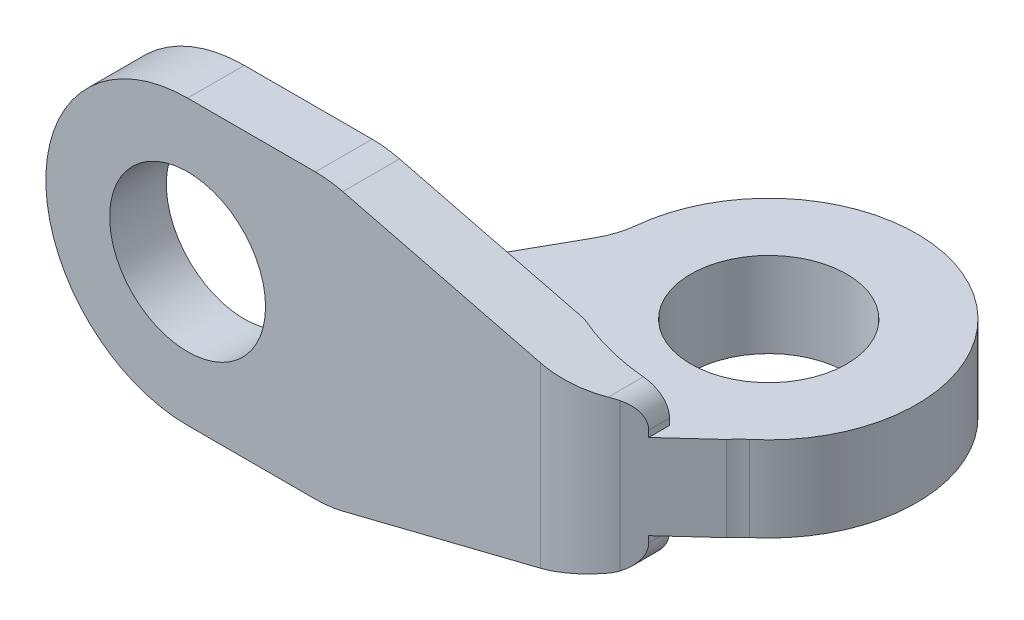
ISO-10303-21;
HEADER;
FILE_DESCRIPTION(('STEP AP214'),'2;1');
FILE_NAME('part.step','',(''),(''),'','','');
FILE_SCHEMA(('AUTOMOTIVE_DESIGN { 1 0 10303 214 1 1 1 1 }'));
ENDSEC;
DATA;
#1=APPLICATION_CONTEXT('core data for automotive mechanical design processes');
#2=APPLICATION_PROTOCOL_DEFINITION('international standard','automotive_design',2000,#1);
#3=PRODUCT_CONTEXT('',#1,'mechanical');
#4=PRODUCT('Part','Part','',(#3));
#5=PRODUCT_RELATED_PRODUCT_CATEGORY('part','',(#4));
#6=PRODUCT_DEFINITION_FORMATION('','',#4);
#7=PRODUCT_DEFINITION_CONTEXT('part definition',#1,'design');
#8=PRODUCT_DEFINITION('design','',#6,#7);
#9=PRODUCT_DEFINITION_SHAPE('','',#8);
#10=(LENGTH_UNIT() NAMED_UNIT(*) SI_UNIT(.MILLI.,.METRE.));
#11=(NAMED_UNIT(*) PLANE_ANGLE_UNIT() SI_UNIT($,.RADIAN.));
#12=(NAMED_UNIT(*) SI_UNIT($,.STERADIAN.) SOLID_ANGLE_UNIT());
#13=UNCERTAINTY_MEASURE_WITH_UNIT(LENGTH_MEASURE(1.E-05),#10,'distance_accuracy_value','');
#14=(GEOMETRIC_REPRESENTATION_CONTEXT(3) GLOBAL_UNCERTAINTY_ASSIGNED_CONTEXT((#13)) GLOBAL_UNIT_ASSIGNED_CONTEXT((#10,
#11,#12)) REPRESENTATION_CONTEXT('',''));
#15=CARTESIAN_POINT('',(0.,0.,0.));
#16=DIRECTION('',(0.,0.,1.));
#17=DIRECTION('',(1.,0.,0.));
#18=AXIS2_PLACEMENT_3D('',#15,#16,#17);
#19=CARTESIAN_POINT('',(0.,0.,0.));
#20=DIRECTION('',(0.,0.,1.));
#21=DIRECTION('',(1.,0.,0.));
#22=AXIS2_PLACEMENT_3D('',#19,#20,#21);
#23=PLANE('',#22);
#24=CARTESIAN_POINT('',(5.,-5.,0.));
#25=DIRECTION('',(0.,0.,1.));
#26=DIRECTION('',(1.,0.,0.));
#27=AXIS2_PLACEMENT_3D('',#24,#25,#26);
#28=CIRCLE('',#27,2.75);
#29=CARTESIAN_POINT('',(7.75,-5.,0.));
#30=VERTEX_POINT('',#29);
#31=EDGE_CURVE('E387',#30,#30,#28,.T.);
#32=ORIENTED_EDGE('',*,*,#31,.T.);
#33=EDGE_LOOP('',(#32));
#34=FACE_BOUND('',#33,.T.);
#35=DIRECTION('',(0.,-1.,0.));
#36=VECTOR('',#35,1.);
#37=CARTESIAN_POINT('',(16.9965399890817,-1.19168295648882E-13,0.));
#38=LINE('',#37,#36);
#39=CARTESIAN_POINT('',(16.9965399890816,-3.50000000000012,0.));
#40=VERTEX_POINT('',#39);
#41=CARTESIAN_POINT('',(16.9965399890817,-1.74913499727042,0.));
#42=VERTEX_POINT('',#41);
#43=EDGE_CURVE('E53',#40,#42,#38,.F.);
#44=ORIENTED_EDGE('',*,*,#43,.F.);
#45=DIRECTION('',(1.,0.,0.));
#46=VECTOR('',#45,1.);
#47=CARTESIAN_POINT('',(0.,-3.5,0.));
#48=LINE('',#47,#46);
#49=CARTESIAN_POINT('',(8.71917257421547,-3.50000000000006,0.));
#50=VERTEX_POINT('',#49);
#51=EDGE_CURVE('E197',#50,#40,#48,.T.);
#52=ORIENTED_EDGE('',*,*,#51,.F.);
#53=DIRECTION('',(0.,-1.,0.));
#54=VECTOR('',#53,1.);
#55=CARTESIAN_POINT('',(8.71917257421545,-6.50000000000006,0.));
#56=LINE('',#55,#54);
#57=CARTESIAN_POINT('',(8.71917257421545,-6.50000000000006,0.));
#58=VERTEX_POINT('',#57);
#59=EDGE_CURVE('E220',#50,#58,#56,.T.);
#60=ORIENTED_EDGE('',*,*,#59,.T.);
#61=DIRECTION('',(1.,0.,0.));
#62=VECTOR('',#61,1.);
#63=CARTESIAN_POINT('',(0.,-6.5,0.));
#64=LINE('',#63,#62);
#65=CARTESIAN_POINT('',(17.,-6.50000000000012,0.));
#66=VERTEX_POINT('',#65);
#67=EDGE_CURVE('E209',#58,#66,#64,.T.);
#68=ORIENTED_EDGE('',*,*,#67,.T.);
#69=DIRECTION('',(0.,1.,0.));
#70=VECTOR('',#69,1.);
#71=CARTESIAN_POINT('',(17.,-10.0000000000001,0.));
#72=LINE('',#71,#70);
#73=CARTESIAN_POINT('',(17.,-8.25,0.));
#74=VERTEX_POINT('',#73);
#75=EDGE_CURVE('E11',#74,#66,#72,.T.);
#76=ORIENTED_EDGE('',*,*,#75,.F.);
#77=DIRECTION('',(-0.970142500145332,-0.242535625036333,0.));
#78=VECTOR('',#77,1.);
#79=CARTESIAN_POINT('',(2.94117647058824,-11.7647058823529,0.));
#80=LINE('',#79,#78);
#81=CARTESIAN_POINT('',(10.4765256976805,-9.88086857557987,0.));
#82=VERTEX_POINT('',#81);
#83=EDGE_CURVE('E369',#74,#82,#80,.T.);
#84=ORIENTED_EDGE('',*,*,#83,.T.);
#85=CARTESIAN_POINT('',(9.50880855378553,-6.01,0.));
#86=DIRECTION('',(0.,0.,1.));
#87=DIRECTION('',(1.,0.,0.));
#88=AXIS2_PLACEMENT_3D('',#85,#86,#87);
#89=CIRCLE('',#88,3.99);
#90=CARTESIAN_POINT('',(9.50880855378552,-10.,0.));
#91=VERTEX_POINT('',#90);
#92=EDGE_CURVE('E371',#82,#91,#89,.F.);
#93=ORIENTED_EDGE('',*,*,#92,.T.);
#94=DIRECTION('',(1.,0.,0.));
#95=VECTOR('',#94,1.);
#96=CARTESIAN_POINT('',(0.,-10.,0.));
#97=LINE('',#96,#95);
#98=CARTESIAN_POINT('',(5.,-10.,0.));
#99=VERTEX_POINT('',#98);
#100=EDGE_CURVE('E374',#99,#91,#97,.T.);
#101=ORIENTED_EDGE('',*,*,#100,.F.);
#102=CARTESIAN_POINT('',(5.,-5.,0.));
#103=DIRECTION('',(0.,0.,1.));
#104=DIRECTION('',(1.,0.,0.));
#105=AXIS2_PLACEMENT_3D('',#102,#103,#104);
#106=CIRCLE('',#105,5.);
#107=CARTESIAN_POINT('',(5.,0.,0.));
#108=VERTEX_POINT('',#107);
#109=EDGE_CURVE('E377',#108,#99,#106,.T.);
#110=ORIENTED_EDGE('',*,*,#109,.F.);
#111=DIRECTION('',(1.,0.,0.));
#112=VECTOR('',#111,1.);
#113=CARTESIAN_POINT('',(0.,0.,0.));
#114=LINE('',#113,#112);
#115=CARTESIAN_POINT('',(9.50880855378552,0.,0.));
#116=VERTEX_POINT('',#115);
#117=EDGE_CURVE('E380',#108,#116,#114,.T.);
#118=ORIENTED_EDGE('',*,*,#117,.T.);
#119=CARTESIAN_POINT('',(9.50880855378553,-3.99,0.));
#120=DIRECTION('',(0.,0.,1.));
#121=DIRECTION('',(1.,0.,0.));
#122=AXIS2_PLACEMENT_3D('',#119,#120,#121);
#123=CIRCLE('',#122,3.99);
#124=CARTESIAN_POINT('',(10.4765256976805,-0.119131424420129,0.));
#125=VERTEX_POINT('',#124);
#126=EDGE_CURVE('E383',#125,#116,#123,.T.);
#127=ORIENTED_EDGE('',*,*,#126,.F.);
#128=DIRECTION('',(-0.970142500145332,0.242535625036333,0.));
#129=VECTOR('',#128,1.);
#130=CARTESIAN_POINT('',(0.588235294117647,2.35294117647059,0.));
#131=LINE('',#130,#129);
#132=EDGE_CURVE('E200',#42,#125,#131,.T.);
#133=ORIENTED_EDGE('',*,*,#132,.F.);
#134=EDGE_LOOP('',(#44,#52,#60,#68,#76,#84,#93,#101,#110,#118,#127,#133));
#135=FACE_BOUND('',#134,.T.);
#136=ADVANCED_FACE('F37',(#34,#135),#23,.F.);
#137=CARTESIAN_POINT('',(20.,0.,2.));
#138=DIRECTION('',(1.,0.,0.));
#139=DIRECTION('',(0.,0.,-1.));
#140=AXIS2_PLACEMENT_3D('',#137,#138,#139);
#141=PLANE('',#140);
#142=DIRECTION('',(0.,0.,-1.));
#143=VECTOR('',#142,1.);
#144=CARTESIAN_POINT('',(20.,-3.50000000000014,2.));
#145=LINE('',#144,#143);
#146=CARTESIAN_POINT('',(20.,-3.50000000000014,0.733070249327034));
#147=VERTEX_POINT('',#146);
#148=CARTESIAN_POINT('',(20.,-3.50000000000014,0.00103909247175984));
#149=VERTEX_POINT('',#148);
#150=EDGE_CURVE('E389',#147,#149,#145,.T.);
#151=ORIENTED_EDGE('',*,*,#150,.T.);
#152=DIRECTION('',(0.,-1.,0.));
#153=VECTOR('',#152,1.);
#154=CARTESIAN_POINT('',(20.,-1.29670579829266E-13,0.00103909247176591));
#155=LINE('',#154,#153);
#156=CARTESIAN_POINT('',(20.,-3.28077640640442,0.00103909247175897));
#157=VERTEX_POINT('',#156);
#158=EDGE_CURVE('E187',#149,#157,#155,.F.);
#159=ORIENTED_EDGE('',*,*,#158,.T.);
#160=DIRECTION('',(0.,0.,-1.));
#161=VECTOR('',#160,1.);
#162=CARTESIAN_POINT('',(20.,-3.28077640640442,2.));
#163=LINE('',#162,#161);
#164=CARTESIAN_POINT('',(20.,-3.28077640640442,0.733070249327036));
#165=VERTEX_POINT('',#164);
#166=EDGE_CURVE('E335',#165,#157,#163,.T.);
#167=ORIENTED_EDGE('',*,*,#166,.F.);
#168=DIRECTION('',(0.,-1.,0.));
#169=VECTOR('',#168,1.);
#170=CARTESIAN_POINT('',(20.,0.,0.733070249327057));
#171=LINE('',#170,#169);
#172=EDGE_CURVE('E427',#165,#147,#171,.T.);
#173=ORIENTED_EDGE('',*,*,#172,.T.);
#174=EDGE_LOOP('',(#151,#159,#167,#173));
#175=FACE_BOUND('',#174,.T.);
#176=ADVANCED_FACE('F261',(#175),#141,.T.);
#177=CARTESIAN_POINT('',(19.,-3.28077640640441,2.));
#178=DIRECTION('',(0.,0.,-1.));
#179=DIRECTION('',(-1.,0.,0.));
#180=AXIS2_PLACEMENT_3D('',#177,#178,#179);
#181=CYLINDRICAL_SURFACE('',#180,1.);
#182=ORIENTED_EDGE('',*,*,#166,.T.);
#183=CARTESIAN_POINT('',(20.,-3.28077640640442,0.00103909247175897));
#184=CARTESIAN_POINT('',(20.0000004772201,-3.25334084201838,0.00103759160879816));
#185=CARTESIAN_POINT('',(19.9988702001035,-3.22591893937733,0.00137810557981637));
#186=CARTESIAN_POINT('',(19.99436544436,-3.17128161308369,0.00272647186715329));
#187=CARTESIAN_POINT('',(19.9909913785738,-3.1440661523788,0.00373420142052705));
#188=CARTESIAN_POINT('',(19.9775555582896,-3.06314392427122,0.00772543560410502));
#189=CARTESIAN_POINT('',(19.9641799405173,-3.00999580997832,0.0116771864258372));
#190=CARTESIAN_POINT('',(19.9290499600717,-2.90682408023911,0.021806194839278));
#191=CARTESIAN_POINT('',(19.9072973608673,-2.85679980975516,0.0279829840124034));
#192=CARTESIAN_POINT('',(19.8560915355715,-2.76111133392463,0.0420343855772149));
#193=CARTESIAN_POINT('',(19.8266364910755,-2.71544816163252,0.0499093988110608));
#194=CARTESIAN_POINT('',(19.7600582698721,-2.62856555197105,0.0669368824096268));
#195=CARTESIAN_POINT('',(19.7227668240214,-2.58748034229938,0.0761156481917256));
#196=CARTESIAN_POINT('',(19.6419711337831,-2.51205663333524,0.0949011354599723));
#197=CARTESIAN_POINT('',(19.5984651843595,-2.47771999177006,0.104507973894493));
#198=CARTESIAN_POINT('',(19.5052356013029,-2.4159461336284,0.123688893339063));
#199=CARTESIAN_POINT('',(19.4553883005009,-2.3886932524952,0.133256713958323));
#200=CARTESIAN_POINT('',(19.3516508545179,-2.3429175309554,0.151497907329219));
#201=CARTESIAN_POINT('',(19.2977582737753,-2.32439999955168,0.160170733643648));
#202=CARTESIAN_POINT('',(19.2425356250363,-2.31063390625908,0.168078255017298));
#203=B_SPLINE_CURVE_WITH_KNOTS('',3,(#183,#184,#185,#186,#187,#188,#189,#190,#191,#192,#193,
#194,#195,#196,#197,#198,#199,#200,#201,#202),.UNSPECIFIED.,.F.,.F.,(4,2,2,2,2,2,2,2,2,4),(0.,
0.0822544623321365,0.164493794629507,0.328482469060576,0.492436640493811,0.656429553468826,
0.824389791870318,0.992396201345743,1.16441453607366,1.33653728253201),.UNSPECIFIED.);
#204=CARTESIAN_POINT('',(19.2425356250363,-2.31063390625908,0.168078255017298));
#205=VERTEX_POINT('',#204);
#206=EDGE_CURVE('E269',#157,#205,#203,.T.);
#207=ORIENTED_EDGE('',*,*,#206,.T.);
#208=DIRECTION('',(0.,0.,-1.));
#209=VECTOR('',#208,1.);
#210=CARTESIAN_POINT('',(19.2425356250363,-2.31063390625908,2.));
#211=LINE('',#210,#209);
#212=CARTESIAN_POINT('',(19.2425356250363,-2.31063390625908,1.40496744680136));
#213=VERTEX_POINT('',#212);
#214=EDGE_CURVE('E214',#213,#205,#211,.T.);
#215=ORIENTED_EDGE('',*,*,#214,.F.);
#216=CARTESIAN_POINT('',(19.2425356250363,-2.31063390625908,1.40496744680136));
#217=CARTESIAN_POINT('',(19.2629985050456,-2.31575029922606,1.38970942599475));
#218=CARTESIAN_POINT('',(19.2831651836685,-2.32147912347447,1.37426407524347));
#219=CARTESIAN_POINT('',(19.3228244442266,-2.33408927877527,1.34309247866337));
#220=CARTESIAN_POINT('',(19.3423186198614,-2.34096762150088,1.32736705325976));
#221=CARTESIAN_POINT('',(19.3806555117763,-2.35583094343052,1.29565102053927));
#222=CARTESIAN_POINT('',(19.3994982539455,-2.36381587859356,1.27966042379818));
#223=CARTESIAN_POINT('',(19.4365587906207,-2.38086912959531,1.24742588586675));
#224=CARTESIAN_POINT('',(19.4547748569164,-2.38994017357489,1.2311813997572));
#225=CARTESIAN_POINT('',(19.4726419843778,-2.39952187188822,1.21485744333106));
#226=B_SPLINE_CURVE_WITH_KNOTS('',3,(#216,#217,#218,#219,#220,#221,#222,#223,#224,#225),
.UNSPECIFIED.,.F.,.F.,(4,2,2,2,4),(0.,0.0780854318201866,0.155970940822855,0.233853350968623,
0.31193566428967),.UNSPECIFIED.);
#227=CARTESIAN_POINT('',(19.4726419843777,-2.39952187188925,1.2148574433312));
#228=VERTEX_POINT('',#227);
#229=EDGE_CURVE('E246',#213,#228,#226,.T.);
#230=ORIENTED_EDGE('',*,*,#229,.T.);
#231=CARTESIAN_POINT('',(19.,-3.28077640640441,1.64665680671652));
#232=DIRECTION('',(0.674487995587138,0.,0.738285814443732));
#233=DIRECTION('',(0.738285814443732,0.,-0.674487995587138));
#234=AXIS2_PLACEMENT_3D('',#231,#232,#233);
#235=ELLIPSE('',#234,1.35448898033272,1.);
#236=EDGE_CURVE('E425',#228,#165,#235,.F.);
#237=ORIENTED_EDGE('',*,*,#236,.T.);
#238=EDGE_LOOP('',(#182,#207,#215,#230,#237));
#239=FACE_BOUND('',#238,.T.);
#240=ADVANCED_FACE('F255',(#239),#181,.T.);
#241=CARTESIAN_POINT('',(19.,-6.71922359359558,2.));
#242=DIRECTION('',(0.,0.,-1.));
#243=DIRECTION('',(-1.,0.,0.));
#244=AXIS2_PLACEMENT_3D('',#241,#242,#243);
#245=CYLINDRICAL_SURFACE('',#244,1.);
#246=CARTESIAN_POINT('',(20.,-6.71922359359558,0.));
#247=CARTESIAN_POINT('',(20.0000004774727,-6.7466588893682,-1.50124823427157E-06));
#248=CARTESIAN_POINT('',(19.9988702222173,-6.77408052331161,0.000339076923073397));
#249=CARTESIAN_POINT('',(19.9943655553478,-6.82871730998671,0.00168769678453366));
#250=CARTESIAN_POINT('',(19.9909915566896,-6.85593249978194,0.00269561565193194));
#251=CARTESIAN_POINT('',(19.9775560134425,-6.93685388125148,0.00668759640664147));
#252=CARTESIAN_POINT('',(19.9641806811535,-6.9900014187888,0.0106400832058489));
#253=CARTESIAN_POINT('',(19.9290514964954,-7.09317200446699,0.0207709625185773));
#254=CARTESIAN_POINT('',(19.9072994096127,-7.14319570840759,0.0269488859809006));
#255=CARTESIAN_POINT('',(19.8560948384683,-7.2388831471983,0.0410028535114292));
#256=CARTESIAN_POINT('',(19.8266405341629,-7.28454584805153,0.0488792988652389));
#257=CARTESIAN_POINT('',(19.76006371641,-7.37142807189875,0.0659099508878017));
#258=CARTESIAN_POINT('',(19.7227728736884,-7.41251331931119,0.0750904678011097));
#259=CARTESIAN_POINT('',(19.6419784435355,-7.48793723441399,0.0938795494802727));
#260=CARTESIAN_POINT('',(19.5984731510726,-7.52227404440171,0.103488231220403));
#261=CARTESIAN_POINT('',(19.5052431510538,-7.58404956376032,0.122673211617995));
#262=CARTESIAN_POINT('',(19.4553945797887,-7.61130364985571,0.132243239385581));
#263=CARTESIAN_POINT('',(19.3516542381598,-7.65708130513248,0.150488629127796));
#264=CARTESIAN_POINT('',(19.2977600308004,-7.67559956233918,0.159163444254734));
#265=CARTESIAN_POINT('',(19.2425356250363,-7.68936609374092,0.167072754040908));
#266=B_SPLINE_CURVE_WITH_KNOTS('',3,(#246,#247,#248,#249,#250,#251,#252,#253,#254,#255,#256,
#257,#258,#259,#260,#261,#262,#263,#264,#265),.UNSPECIFIED.,.F.,.F.,(4,2,2,2,2,2,2,2,2,4),(0.,
0.0822536562973416,0.164492178176201,0.328479134498837,0.492431547795576,0.65642273831652,
0.824382731891326,0.992388896751938,1.16441326430609,1.3365420999051),.UNSPECIFIED.);
#267=CARTESIAN_POINT('',(20.,-6.71922359359558,0.));
#268=VERTEX_POINT('',#267);
#269=CARTESIAN_POINT('',(19.2425356250363,-7.68936609374092,0.167072754040909));
#270=VERTEX_POINT('',#269);
#271=EDGE_CURVE('E289',#268,#270,#266,.T.);
#272=ORIENTED_EDGE('',*,*,#271,.F.);
#273=DIRECTION('',(0.,0.,-1.));
#274=VECTOR('',#273,1.);
#275=CARTESIAN_POINT('',(20.,-6.71922359359558,2.));
#276=LINE('',#275,#274);
#277=CARTESIAN_POINT('',(20.,-6.71922359359558,0.733070249327015));
#278=VERTEX_POINT('',#277);
#279=EDGE_CURVE('E362',#278,#268,#276,.T.);
#280=ORIENTED_EDGE('',*,*,#279,.F.);
#281=CARTESIAN_POINT('',(19.,-6.71922359359558,1.64665680671649));
#282=DIRECTION('',(0.674487995587138,0.,0.738285814443732));
#283=DIRECTION('',(0.738285814443732,0.,-0.674487995587138));
#284=AXIS2_PLACEMENT_3D('',#281,#282,#283);
#285=ELLIPSE('',#284,1.35448898033272,1.);
#286=CARTESIAN_POINT('',(19.4726419843776,-7.60047812811077,1.2148574433312));
#287=VERTEX_POINT('',#286);
#288=EDGE_CURVE('E432',#287,#278,#285,.T.);
#289=ORIENTED_EDGE('',*,*,#288,.F.);
#290=CARTESIAN_POINT('',(19.4726419843776,-7.60047812811077,1.2148574433312));
#291=CARTESIAN_POINT('',(19.4547748569164,-7.61005982642473,1.23118139975719));
#292=CARTESIAN_POINT('',(19.4365587906207,-7.61913087040457,1.2474258858667));
#293=CARTESIAN_POINT('',(19.3994982539455,-7.63618412140652,1.2796604237981));
#294=CARTESIAN_POINT('',(19.3806555117764,-7.64416905656949,1.29565102053922));
#295=CARTESIAN_POINT('',(19.3423186198614,-7.65903237849909,1.32736705325972));
#296=CARTESIAN_POINT('',(19.3228244442266,-7.66591072122471,1.34309247866334));
#297=CARTESIAN_POINT('',(19.2831651836685,-7.67852087652554,1.37426407524344));
#298=CARTESIAN_POINT('',(19.2629985050456,-7.68424970077397,1.38970942599472));
#299=CARTESIAN_POINT('',(19.2425356250363,-7.68936609374092,1.40496744680133));
#300=B_SPLINE_CURVE_WITH_KNOTS('',3,(#290,#291,#292,#293,#294,#295,#296,#297,#298,#299),
.UNSPECIFIED.,.F.,.F.,(4,2,2,2,4),(0.,0.0780823133211076,0.155964723466912,0.233850232469582,
0.311935664289792),.UNSPECIFIED.);
#301=CARTESIAN_POINT('',(19.2425356250363,-7.68936609374092,1.40496744680133));
#302=VERTEX_POINT('',#301);
#303=EDGE_CURVE('E310',#287,#302,#300,.T.);
#304=ORIENTED_EDGE('',*,*,#303,.T.);
#305=DIRECTION('',(0.,0.,-1.));
#306=VECTOR('',#305,1.);
#307=CARTESIAN_POINT('',(19.2425356250363,-7.68936609374092,2.));
#308=LINE('',#307,#306);
#309=EDGE_CURVE('E325',#302,#270,#308,.T.);
#310=ORIENTED_EDGE('',*,*,#309,.T.);
#311=EDGE_LOOP('',(#272,#280,#289,#304,#310));
#312=FACE_BOUND('',#311,.T.);
#313=ADVANCED_FACE('F260',(#312),#245,.T.);
#314=CARTESIAN_POINT('',(0.588235294117647,2.35294117647059,2.));
#315=DIRECTION('',(-0.242535625036333,-0.970142500145332,0.));
#316=DIRECTION('',(0.970142500145332,-0.242535625036333,0.));
#317=AXIS2_PLACEMENT_3D('',#314,#315,#316);
#318=PLANE('',#317);
#319=CARTESIAN_POINT('',(18.5,-2.12500000000001,-5.));
#320=DIRECTION('',(-0.242535625036333,-0.970142500145332,0.));
#321=DIRECTION('',(0.970142500145332,-0.242535625036333,0.));
#322=AXIS2_PLACEMENT_3D('',#319,#320,#321);
#323=ELLIPSE('',#322,5.38183672222667,5.22114853307495);
#324=EDGE_CURVE('E192',#42,#205,#323,.F.);
#325=ORIENTED_EDGE('',*,*,#324,.F.);
#326=ORIENTED_EDGE('',*,*,#132,.T.);
#327=DIRECTION('',(0.,0.,-1.));
#328=VECTOR('',#327,1.);
#329=CARTESIAN_POINT('',(10.4765256976805,-0.119131424420129,2.));
#330=LINE('',#329,#328);
#331=CARTESIAN_POINT('',(10.4765256976805,-0.119131424420129,2.));
#332=VERTEX_POINT('',#331);
#333=EDGE_CURVE('E346',#332,#125,#330,.T.);
#334=ORIENTED_EDGE('',*,*,#333,.F.);
#335=DIRECTION('',(-0.970142500145332,0.242535625036333,0.));
#336=VECTOR('',#335,1.);
#337=CARTESIAN_POINT('',(0.588235294117647,2.35294117647059,2.));
#338=LINE('',#337,#336);
#339=CARTESIAN_POINT('',(17.4491779976163,-1.86229449940407,2.));
#340=VERTEX_POINT('',#339);
#341=EDGE_CURVE('E343',#340,#332,#338,.T.);
#342=ORIENTED_EDGE('',*,*,#341,.F.);
#343=CARTESIAN_POINT('',(17.4491779976163,-1.86229449940407,-1.));
#344=DIRECTION('',(-0.242535625036333,-0.970142500145332,0.));
#345=DIRECTION('',(-0.970142500145332,0.242535625036333,0.));
#346=AXIS2_PLACEMENT_3D('',#343,#344,#345);
#347=ELLIPSE('',#346,3.09232921921324,3.);
#348=EDGE_CURVE('E244',#340,#213,#347,.F.);
#349=ORIENTED_EDGE('',*,*,#348,.T.);
#350=ORIENTED_EDGE('',*,*,#214,.T.);
#351=EDGE_LOOP('',(#325,#326,#334,#342,#349,#350));
#352=FACE_BOUND('',#351,.T.);
#353=ADVANCED_FACE('F263',(#352),#318,.F.);
#354=CARTESIAN_POINT('',(2.94117647058824,-11.7647058823529,2.));
#355=DIRECTION('',(0.242535625036333,-0.970142500145332,0.));
#356=DIRECTION('',(0.970142500145332,0.242535625036333,0.));
#357=AXIS2_PLACEMENT_3D('',#354,#355,#356);
#358=PLANE('',#357);
#359=ORIENTED_EDGE('',*,*,#83,.F.);
#360=CARTESIAN_POINT('',(18.5,-7.875,-5.));
#361=DIRECTION('',(0.242535625036333,-0.970142500145332,0.));
#362=DIRECTION('',(0.970142500145332,0.242535625036333,0.));
#363=AXIS2_PLACEMENT_3D('',#360,#361,#362);
#364=ELLIPSE('',#363,5.38081081250773,5.22015325445527);
#365=EDGE_CURVE('E298',#74,#270,#364,.F.);
#366=ORIENTED_EDGE('',*,*,#365,.T.);
#367=ORIENTED_EDGE('',*,*,#309,.F.);
#368=CARTESIAN_POINT('',(17.4491779976162,-8.13770550059595,-1.));
#369=DIRECTION('',(0.242535625036333,-0.970142500145332,0.));
#370=DIRECTION('',(0.970142500145332,0.242535625036333,0.));
#371=AXIS2_PLACEMENT_3D('',#368,#369,#370);
#372=ELLIPSE('',#371,3.09232921921325,3.);
#373=CARTESIAN_POINT('',(17.4491779976162,-8.13770550059595,2.));
#374=VERTEX_POINT('',#373);
#375=EDGE_CURVE('E46',#302,#374,#372,.T.);
#376=ORIENTED_EDGE('',*,*,#375,.T.);
#377=DIRECTION('',(-0.970142500145332,-0.242535625036333,0.));
#378=VECTOR('',#377,1.);
#379=CARTESIAN_POINT('',(2.94117647058824,-11.7647058823529,2.));
#380=LINE('',#379,#378);
#381=CARTESIAN_POINT('',(10.4765256976805,-9.88086857557987,2.));
#382=VERTEX_POINT('',#381);
#383=EDGE_CURVE('E321',#374,#382,#380,.T.);
#384=ORIENTED_EDGE('',*,*,#383,.T.);
#385=DIRECTION('',(0.,0.,-1.));
#386=VECTOR('',#385,1.);
#387=CARTESIAN_POINT('',(10.4765256976805,-9.88086857557987,2.));
#388=LINE('',#387,#386);
#389=EDGE_CURVE('E359',#382,#82,#388,.T.);
#390=ORIENTED_EDGE('',*,*,#389,.T.);
#391=EDGE_LOOP('',(#359,#366,#367,#376,#384,#390));
#392=FACE_BOUND('',#391,.T.);
#393=ADVANCED_FACE('F307',(#392),#358,.T.);
#394=DIRECTION('',(0.,0.,-1.));
#395=VECTOR('',#394,1.);
#396=CARTESIAN_POINT('',(20.,-6.50000000000014,2.));
#397=LINE('',#396,#395);
#398=CARTESIAN_POINT('',(20.,-6.50000000000014,0.733070249327018));
#399=VERTEX_POINT('',#398);
#400=CARTESIAN_POINT('',(20.,-6.50000000000014,0.));
#401=VERTEX_POINT('',#400);
#402=EDGE_CURVE('E406',#399,#401,#397,.T.);
#403=ORIENTED_EDGE('',*,*,#402,.F.);
#404=DIRECTION('',(0.,-1.,0.));
#405=VECTOR('',#404,1.);
#406=CARTESIAN_POINT('',(20.,0.,0.733070249327057));
#407=LINE('',#406,#405);
#408=EDGE_CURVE('E433',#399,#278,#407,.T.);
#409=ORIENTED_EDGE('',*,*,#408,.T.);
#410=ORIENTED_EDGE('',*,*,#279,.T.);
#411=DIRECTION('',(0.,-1.,0.));
#412=VECTOR('',#411,1.);
#413=CARTESIAN_POINT('',(20.,0.,0.));
#414=LINE('',#413,#412);
#415=EDGE_CURVE('E366',#401,#268,#414,.T.);
#416=ORIENTED_EDGE('',*,*,#415,.F.);
#417=EDGE_LOOP('',(#403,#409,#410,#416));
#418=FACE_BOUND('',#417,.T.);
#419=ADVANCED_FACE('F444',(#418),#141,.T.);
#420=CARTESIAN_POINT('',(0.,0.,2.));
#421=DIRECTION('',(0.,0.,1.));
#422=DIRECTION('',(1.,0.,0.));
#423=AXIS2_PLACEMENT_3D('',#420,#421,#422);
#424=PLANE('',#423);
#425=CARTESIAN_POINT('',(5.,-5.,2.));
#426=DIRECTION('',(0.,0.,1.));
#427=DIRECTION('',(1.,0.,0.));
#428=AXIS2_PLACEMENT_3D('',#425,#426,#427);
#429=CIRCLE('',#428,2.75);
#430=CARTESIAN_POINT('',(7.75,-5.,2.));
#431=VERTEX_POINT('',#430);
#432=EDGE_CURVE('E368',#431,#431,#429,.T.);
#433=ORIENTED_EDGE('',*,*,#432,.F.);
#434=EDGE_LOOP('',(#433));
#435=FACE_BOUND('',#434,.T.);
#436=ORIENTED_EDGE('',*,*,#383,.F.);
#437=DIRECTION('',(0.,1.,0.));
#438=VECTOR('',#437,1.);
#439=CARTESIAN_POINT('',(17.4491779976163,-1.21846958713659E-13,2.));
#440=LINE('',#439,#438);
#441=EDGE_CURVE('E241',#374,#340,#440,.T.);
#442=ORIENTED_EDGE('',*,*,#441,.T.);
#443=ORIENTED_EDGE('',*,*,#341,.T.);
#444=CARTESIAN_POINT('',(9.50880855378553,-3.99,2.));
#445=DIRECTION('',(0.,0.,1.));
#446=DIRECTION('',(1.,0.,0.));
#447=AXIS2_PLACEMENT_3D('',#444,#445,#446);
#448=CIRCLE('',#447,3.99);
#449=CARTESIAN_POINT('',(9.50880855378552,0.,2.));
#450=VERTEX_POINT('',#449);
#451=EDGE_CURVE('E400',#332,#450,#448,.T.);
#452=ORIENTED_EDGE('',*,*,#451,.T.);
#453=DIRECTION('',(1.,0.,0.));
#454=VECTOR('',#453,1.);
#455=CARTESIAN_POINT('',(0.,0.,2.));
#456=LINE('',#455,#454);
#457=CARTESIAN_POINT('',(5.,0.,2.));
#458=VERTEX_POINT('',#457);
#459=EDGE_CURVE('E397',#458,#450,#456,.T.);
#460=ORIENTED_EDGE('',*,*,#459,.F.);
#461=CARTESIAN_POINT('',(5.,-5.,2.));
#462=DIRECTION('',(0.,0.,1.));
#463=DIRECTION('',(1.,0.,0.));
#464=AXIS2_PLACEMENT_3D('',#461,#462,#463);
#465=CIRCLE('',#464,5.);
#466=CARTESIAN_POINT('',(5.,-10.,2.));
#467=VERTEX_POINT('',#466);
#468=EDGE_CURVE('E394',#458,#467,#465,.T.);
#469=ORIENTED_EDGE('',*,*,#468,.T.);
#470=DIRECTION('',(1.,0.,0.));
#471=VECTOR('',#470,1.);
#472=CARTESIAN_POINT('',(0.,-10.,2.));
#473=LINE('',#472,#471);
#474=CARTESIAN_POINT('',(9.50880855378552,-10.,2.));
#475=VERTEX_POINT('',#474);
#476=EDGE_CURVE('E392',#467,#475,#473,.T.);
#477=ORIENTED_EDGE('',*,*,#476,.T.);
#478=CARTESIAN_POINT('',(9.50880855378553,-6.01,2.));
#479=DIRECTION('',(0.,0.,1.));
#480=DIRECTION('',(1.,0.,0.));
#481=AXIS2_PLACEMENT_3D('',#478,#479,#480);
#482=CIRCLE('',#481,3.99);
#483=EDGE_CURVE('E334',#382,#475,#482,.F.);
#484=ORIENTED_EDGE('',*,*,#483,.F.);
#485=EDGE_LOOP('',(#436,#442,#443,#452,#460,#469,#477,#484));
#486=FACE_BOUND('',#485,.T.);
#487=ADVANCED_FACE('F331',(#435,#486),#424,.T.);
#488=CARTESIAN_POINT('',(0.,-3.5,0.));
#489=DIRECTION('',(0.,-1.,0.));
#490=DIRECTION('',(1.,0.,0.));
#491=AXIS2_PLACEMENT_3D('',#488,#489,#490);
#492=PLANE('',#491);
#493=ORIENTED_EDGE('',*,*,#51,.T.);
#494=CARTESIAN_POINT('',(18.5,-3.50000000000013,-5.));
#495=DIRECTION('',(0.,1.,0.));
#496=DIRECTION('',(-1.,0.,0.));
#497=AXIS2_PLACEMENT_3D('',#494,#495,#496);
#498=CIRCLE('',#497,5.22114853307495);
#499=EDGE_CURVE('E184',#40,#149,#498,.T.);
#500=ORIENTED_EDGE('',*,*,#499,.T.);
#501=ORIENTED_EDGE('',*,*,#150,.F.);
#502=DIRECTION('',(-0.738285814443732,0.,0.674487995587138));
#503=VECTOR('',#502,1.);
#504=CARTESIAN_POINT('',(9.46372439126384,-3.50000000000007,10.358870010419));
#505=LINE('',#504,#503);
#506=CARTESIAN_POINT('',(21.4325118635672,-3.50000000000015,-0.575653332528868));
#507=VERTEX_POINT('',#506);
#508=EDGE_CURVE('E430',#507,#147,#505,.T.);
#509=ORIENTED_EDGE('',*,*,#508,.F.);
#510=CARTESIAN_POINT('',(23.7606733705275,-3.50000000000017,1.31634666681261));
#511=DIRECTION('',(0.,-1.,0.));
#512=DIRECTION('',(1.,0.,0.));
#513=AXIS2_PLACEMENT_3D('',#510,#511,#512);
#514=CIRCLE('',#513,3.);
#515=CARTESIAN_POINT('',(21.8407553807955,-3.50000000000015,-0.988846364736714));
#516=VERTEX_POINT('',#515);
#517=EDGE_CURVE('E230',#507,#516,#514,.T.);
#518=ORIENTED_EDGE('',*,*,#517,.T.);
#519=CARTESIAN_POINT('',(18.5,-3.50000000000013,-5.));
#520=DIRECTION('',(0.,-1.,0.));
#521=DIRECTION('',(1.,0.,0.));
#522=AXIS2_PLACEMENT_3D('',#519,#520,#521);
#523=CIRCLE('',#522,5.22015325445527);
#524=CARTESIAN_POINT('',(13.3088304575938,-3.50000000000009,-5.54932575216714));
#525=VERTEX_POINT('',#524);
#526=EDGE_CURVE('E411',#525,#516,#523,.T.);
#527=ORIENTED_EDGE('',*,*,#526,.F.);
#528=CARTESIAN_POINT('',(10.3254872743401,-3.50000000000007,-5.86502093891189));
#529=DIRECTION('',(0.,-1.,0.));
#530=DIRECTION('',(1.,0.,0.));
#531=AXIS2_PLACEMENT_3D('',#528,#529,#530);
#532=CIRCLE('',#531,3.);
#533=CARTESIAN_POINT('',(12.9422640244781,-3.50000000000009,-4.39788787066718));
#534=VERTEX_POINT('',#533);
#535=EDGE_CURVE('E237',#525,#534,#532,.T.);
#536=ORIENTED_EDGE('',*,*,#535,.T.);
#537=DIRECTION('',(-0.489044356081569,0.,0.872258916712672));
#538=VECTOR('',#537,1.);
#539=CARTESIAN_POINT('',(7.97091390143273,-3.50000000000006,4.46900614211994));
#540=LINE('',#539,#538);
#541=CARTESIAN_POINT('',(11.3359493243535,-3.50000000000008,-1.53286693175529));
#542=VERTEX_POINT('',#541);
#543=EDGE_CURVE('E414',#534,#542,#540,.T.);
#544=ORIENTED_EDGE('',*,*,#543,.T.);
#545=CARTESIAN_POINT('',(8.71917257421547,-3.50000000000006,-3.));
#546=DIRECTION('',(0.,-1.,0.));
#547=DIRECTION('',(1.,0.,0.));
#548=AXIS2_PLACEMENT_3D('',#545,#546,#547);
#549=CIRCLE('',#548,3.);
#550=EDGE_CURVE('E206',#542,#50,#549,.T.);
#551=ORIENTED_EDGE('',*,*,#550,.T.);
#552=EDGE_LOOP('',(#493,#500,#501,#509,#518,#527,#536,#544,#551));
#553=FACE_BOUND('',#552,.T.);
#554=CARTESIAN_POINT('',(18.5,-3.50000000000013,-5.));
#555=DIRECTION('',(0.,-1.,0.));
#556=DIRECTION('',(1.,0.,0.));
#557=AXIS2_PLACEMENT_3D('',#554,#555,#556);
#558=CIRCLE('',#557,2.75);
#559=CARTESIAN_POINT('',(21.25,-3.50000000000015,-5.));
#560=VERTEX_POINT('',#559);
#561=EDGE_CURVE('E408',#560,#560,#558,.T.);
#562=ORIENTED_EDGE('',*,*,#561,.T.);
#563=EDGE_LOOP('',(#562));
#564=FACE_BOUND('',#563,.T.);
#565=ADVANCED_FACE('F202',(#553,#564),#492,.F.);
#566=CARTESIAN_POINT('',(0.,-6.5,0.));
#567=DIRECTION('',(0.,-1.,0.));
#568=DIRECTION('',(1.,0.,0.));
#569=AXIS2_PLACEMENT_3D('',#566,#567,#568);
#570=PLANE('',#569);
#571=CARTESIAN_POINT('',(18.5,-6.50000000000013,-5.));
#572=DIRECTION('',(0.,-1.,0.));
#573=DIRECTION('',(1.,0.,0.));
#574=AXIS2_PLACEMENT_3D('',#571,#572,#573);
#575=CIRCLE('',#574,5.22015325445527);
#576=EDGE_CURVE('E61',#401,#66,#575,.T.);
#577=ORIENTED_EDGE('',*,*,#576,.T.);
#578=ORIENTED_EDGE('',*,*,#67,.F.);
#579=CARTESIAN_POINT('',(8.71917257421545,-6.50000000000006,-3.));
#580=DIRECTION('',(0.,-1.,0.));
#581=DIRECTION('',(1.,0.,0.));
#582=AXIS2_PLACEMENT_3D('',#579,#580,#581);
#583=CIRCLE('',#582,3.);
#584=CARTESIAN_POINT('',(11.3359493243535,-6.50000000000008,-1.53286693175529));
#585=VERTEX_POINT('',#584);
#586=EDGE_CURVE('E232',#58,#585,#583,.F.);
#587=ORIENTED_EDGE('',*,*,#586,.T.);
#588=DIRECTION('',(-0.489044356081569,0.,0.872258916712672));
#589=VECTOR('',#588,1.);
#590=CARTESIAN_POINT('',(7.97091390143271,-6.50000000000006,4.46900614211994));
#591=LINE('',#590,#589);
#592=CARTESIAN_POINT('',(12.9422640244781,-6.50000000000009,-4.39788787066718));
#593=VERTEX_POINT('',#592);
#594=EDGE_CURVE('E422',#593,#585,#591,.T.);
#595=ORIENTED_EDGE('',*,*,#594,.F.);
#596=CARTESIAN_POINT('',(10.3254872743401,-6.50000000000007,-5.86502093891189));
#597=DIRECTION('',(0.,-1.,0.));
#598=DIRECTION('',(1.,0.,0.));
#599=AXIS2_PLACEMENT_3D('',#596,#597,#598);
#600=CIRCLE('',#599,3.);
#601=CARTESIAN_POINT('',(13.3088304575938,-6.50000000000009,-5.54932575216714));
#602=VERTEX_POINT('',#601);
#603=EDGE_CURVE('E235',#593,#602,#600,.F.);
#604=ORIENTED_EDGE('',*,*,#603,.T.);
#605=CARTESIAN_POINT('',(18.5,-6.50000000000013,-5.));
#606=DIRECTION('',(0.,-1.,0.));
#607=DIRECTION('',(1.,0.,0.));
#608=AXIS2_PLACEMENT_3D('',#605,#606,#607);
#609=CIRCLE('',#608,5.22015325445527);
#610=CARTESIAN_POINT('',(21.8407553807955,-6.50000000000015,-0.988846364736723));
#611=VERTEX_POINT('',#610);
#612=EDGE_CURVE('E419',#602,#611,#609,.T.);
#613=ORIENTED_EDGE('',*,*,#612,.T.);
#614=CARTESIAN_POINT('',(23.7606733705275,-6.50000000000017,1.31634666681261));
#615=DIRECTION('',(0.,-1.,0.));
#616=DIRECTION('',(1.,0.,0.));
#617=AXIS2_PLACEMENT_3D('',#614,#615,#616);
#618=CIRCLE('',#617,3.);
#619=CARTESIAN_POINT('',(21.4325118635671,-6.50000000000015,-0.575653332528872));
#620=VERTEX_POINT('',#619);
#621=EDGE_CURVE('E227',#611,#620,#618,.F.);
#622=ORIENTED_EDGE('',*,*,#621,.T.);
#623=DIRECTION('',(-0.738285814443732,0.,0.674487995587138));
#624=VECTOR('',#623,1.);
#625=CARTESIAN_POINT('',(9.46372439126382,-6.50000000000007,10.3588700104191));
#626=LINE('',#625,#624);
#627=EDGE_CURVE('E297',#620,#399,#626,.T.);
#628=ORIENTED_EDGE('',*,*,#627,.T.);
#629=ORIENTED_EDGE('',*,*,#402,.T.);
#630=EDGE_LOOP('',(#577,#578,#587,#595,#604,#613,#622,#628,#629));
#631=FACE_BOUND('',#630,.T.);
#632=CARTESIAN_POINT('',(18.5,-6.50000000000013,-5.));
#633=DIRECTION('',(0.,-1.,0.));
#634=DIRECTION('',(1.,0.,0.));
#635=AXIS2_PLACEMENT_3D('',#632,#633,#634);
#636=CIRCLE('',#635,2.75);
#637=CARTESIAN_POINT('',(21.25,-6.50000000000015,-5.));
#638=VERTEX_POINT('',#637);
#639=EDGE_CURVE('E416',#638,#638,#636,.T.);
#640=ORIENTED_EDGE('',*,*,#639,.F.);
#641=EDGE_LOOP('',(#640));
#642=FACE_BOUND('',#641,.T.);
#643=ADVANCED_FACE('F439',(#631,#642),#570,.T.);
#644=CARTESIAN_POINT('',(23.7606733705275,-3.50000000000017,1.31634666681261));
#645=DIRECTION('',(0.,-1.,0.));
#646=DIRECTION('',(1.,0.,0.));
#647=AXIS2_PLACEMENT_3D('',#644,#645,#646);
#648=CYLINDRICAL_SURFACE('',#647,3.);
#649=DIRECTION('',(0.,-1.,0.));
#650=VECTOR('',#649,1.);
#651=CARTESIAN_POINT('',(21.4325118635672,-3.50000000000015,-0.575653332528866));
#652=LINE('',#651,#650);
#653=EDGE_CURVE('E239',#620,#507,#652,.F.);
#654=ORIENTED_EDGE('',*,*,#653,.F.);
#655=ORIENTED_EDGE('',*,*,#621,.F.);
#656=DIRECTION('',(0.,-1.,0.));
#657=VECTOR('',#656,1.);
#658=CARTESIAN_POINT('',(21.8407553807955,-3.50000000000015,-0.988846364736718));
#659=LINE('',#658,#657);
#660=EDGE_CURVE('E211',#516,#611,#659,.T.);
#661=ORIENTED_EDGE('',*,*,#660,.F.);
#662=ORIENTED_EDGE('',*,*,#517,.F.);
#663=EDGE_LOOP('',(#654,#655,#661,#662));
#664=FACE_BOUND('',#663,.T.);
#665=ADVANCED_FACE('F455',(#664),#648,.F.);
#666=CARTESIAN_POINT('',(9.50880855378553,-3.99,2.));
#667=DIRECTION('',(0.,0.,-1.));
#668=DIRECTION('',(-1.,0.,0.));
#669=AXIS2_PLACEMENT_3D('',#666,#667,#668);
#670=CYLINDRICAL_SURFACE('',#669,3.99);
#671=ORIENTED_EDGE('',*,*,#126,.T.);
#672=DIRECTION('',(0.,0.,-1.));
#673=VECTOR('',#672,1.);
#674=CARTESIAN_POINT('',(9.50880855378552,0.,2.));
#675=LINE('',#674,#673);
#676=EDGE_CURVE('E348',#450,#116,#675,.T.);
#677=ORIENTED_EDGE('',*,*,#676,.F.);
#678=ORIENTED_EDGE('',*,*,#451,.F.);
#679=ORIENTED_EDGE('',*,*,#333,.T.);
#680=EDGE_LOOP('',(#671,#677,#678,#679));
#681=FACE_BOUND('',#680,.T.);
#682=ADVANCED_FACE('F491',(#681),#670,.T.);
#683=CARTESIAN_POINT('',(0.,0.,2.));
#684=DIRECTION('',(0.,1.,0.));
#685=DIRECTION('',(0.,0.,1.));
#686=AXIS2_PLACEMENT_3D('',#683,#684,#685);
#687=PLANE('',#686);
#688=ORIENTED_EDGE('',*,*,#117,.F.);
#689=DIRECTION('',(0.,0.,-1.));
#690=VECTOR('',#689,1.);
#691=CARTESIAN_POINT('',(5.,0.,2.));
#692=LINE('',#691,#690);
#693=EDGE_CURVE('E352',#458,#108,#692,.T.);
#694=ORIENTED_EDGE('',*,*,#693,.F.);
#695=ORIENTED_EDGE('',*,*,#459,.T.);
#696=ORIENTED_EDGE('',*,*,#676,.T.);
#697=EDGE_LOOP('',(#688,#694,#695,#696));
#698=FACE_BOUND('',#697,.T.);
#699=ADVANCED_FACE('F487',(#698),#687,.T.);
#700=CARTESIAN_POINT('',(5.,-5.,2.));
#701=DIRECTION('',(0.,0.,-1.));
#702=DIRECTION('',(-1.,0.,0.));
#703=AXIS2_PLACEMENT_3D('',#700,#701,#702);
#704=CYLINDRICAL_SURFACE('',#703,5.);
#705=ORIENTED_EDGE('',*,*,#109,.T.);
#706=DIRECTION('',(0.,0.,-1.));
#707=VECTOR('',#706,1.);
#708=CARTESIAN_POINT('',(5.,-10.,2.));
#709=LINE('',#708,#707);
#710=EDGE_CURVE('E354',#467,#99,#709,.T.);
#711=ORIENTED_EDGE('',*,*,#710,.F.);
#712=ORIENTED_EDGE('',*,*,#468,.F.);
#713=ORIENTED_EDGE('',*,*,#693,.T.);
#714=EDGE_LOOP('',(#705,#711,#712,#713));
#715=FACE_BOUND('',#714,.T.);
#716=ADVANCED_FACE('F484',(#715),#704,.T.);
#717=CARTESIAN_POINT('',(0.,-10.,2.));
#718=DIRECTION('',(0.,1.,0.));
#719=DIRECTION('',(0.,0.,1.));
#720=AXIS2_PLACEMENT_3D('',#717,#718,#719);
#721=PLANE('',#720);
#722=ORIENTED_EDGE('',*,*,#100,.T.);
#723=DIRECTION('',(0.,0.,-1.));
#724=VECTOR('',#723,1.);
#725=CARTESIAN_POINT('',(9.50880855378552,-10.,2.));
#726=LINE('',#725,#724);
#727=EDGE_CURVE('E357',#475,#91,#726,.T.);
#728=ORIENTED_EDGE('',*,*,#727,.F.);
#729=ORIENTED_EDGE('',*,*,#476,.F.);
#730=ORIENTED_EDGE('',*,*,#710,.T.);
#731=EDGE_LOOP('',(#722,#728,#729,#730));
#732=FACE_BOUND('',#731,.T.);
#733=ADVANCED_FACE('F481',(#732),#721,.F.);
#734=CARTESIAN_POINT('',(9.50880855378553,-6.01,2.));
#735=DIRECTION('',(0.,0.,-1.));
#736=DIRECTION('',(-1.,0.,0.));
#737=AXIS2_PLACEMENT_3D('',#734,#735,#736);
#738=CYLINDRICAL_SURFACE('',#737,3.99);
#739=ORIENTED_EDGE('',*,*,#92,.F.);
#740=ORIENTED_EDGE('',*,*,#389,.F.);
#741=ORIENTED_EDGE('',*,*,#483,.T.);
#742=ORIENTED_EDGE('',*,*,#727,.T.);
#743=EDGE_LOOP('',(#739,#740,#741,#742));
#744=FACE_BOUND('',#743,.T.);
#745=ADVANCED_FACE('F475',(#744),#738,.T.);
#746=CARTESIAN_POINT('',(5.,-5.,2.));
#747=DIRECTION('',(0.,0.,-1.));
#748=DIRECTION('',(-1.,0.,0.));
#749=AXIS2_PLACEMENT_3D('',#746,#747,#748);
#750=CYLINDRICAL_SURFACE('',#749,2.75);
#751=ORIENTED_EDGE('',*,*,#432,.T.);
#752=EDGE_LOOP('',(#751));
#753=FACE_BOUND('',#752,.T.);
#754=ORIENTED_EDGE('',*,*,#31,.F.);
#755=EDGE_LOOP('',(#754));
#756=FACE_BOUND('',#755,.T.);
#757=ADVANCED_FACE('F265',(#753,#756),#750,.F.);
#758=CARTESIAN_POINT('',(18.5,-3.50000000000013,-5.));
#759=DIRECTION('',(0.,-1.,0.));
#760=DIRECTION('',(1.,0.,0.));
#761=AXIS2_PLACEMENT_3D('',#758,#759,#760);
#762=CYLINDRICAL_SURFACE('',#761,5.22015325445527);
#763=ORIENTED_EDGE('',*,*,#526,.T.);
#764=ORIENTED_EDGE('',*,*,#660,.T.);
#765=ORIENTED_EDGE('',*,*,#612,.F.);
#766=DIRECTION('',(0.,-1.,0.));
#767=VECTOR('',#766,1.);
#768=CARTESIAN_POINT('',(13.3088304575938,-3.50000000000009,-5.54932575216714));
#769=LINE('',#768,#767);
#770=EDGE_CURVE('E208',#602,#525,#769,.F.);
#771=ORIENTED_EDGE('',*,*,#770,.T.);
#772=EDGE_LOOP('',(#763,#764,#765,#771));
#773=FACE_BOUND('',#772,.T.);
#774=ADVANCED_FACE('F458',(#773),#762,.T.);
#775=CARTESIAN_POINT('',(7.97091390143273,-3.50000000000006,4.46900614211994));
#776=DIRECTION('',(0.872258916712672,0.,0.489044356081569));
#777=DIRECTION('',(0.489044356081569,0.,-0.872258916712672));
#778=AXIS2_PLACEMENT_3D('',#775,#776,#777);
#779=PLANE('',#778);
#780=ORIENTED_EDGE('',*,*,#594,.T.);
#781=DIRECTION('',(0.,-1.,0.));
#782=VECTOR('',#781,1.);
#783=CARTESIAN_POINT('',(11.3359493243535,-3.50000000000008,-1.53286693175529));
#784=LINE('',#783,#782);
#785=EDGE_CURVE('E225',#585,#542,#784,.F.);
#786=ORIENTED_EDGE('',*,*,#785,.T.);
#787=ORIENTED_EDGE('',*,*,#543,.F.);
#788=DIRECTION('',(0.,-1.,0.));
#789=VECTOR('',#788,1.);
#790=CARTESIAN_POINT('',(12.9422640244781,-3.50000000000009,-4.39788787066718));
#791=LINE('',#790,#789);
#792=EDGE_CURVE('E222',#534,#593,#791,.T.);
#793=ORIENTED_EDGE('',*,*,#792,.T.);
#794=EDGE_LOOP('',(#780,#786,#787,#793));
#795=FACE_BOUND('',#794,.T.);
#796=ADVANCED_FACE('F467',(#795),#779,.F.);
#797=CARTESIAN_POINT('',(18.5,-3.50000000000013,-5.));
#798=DIRECTION('',(0.,-1.,0.));
#799=DIRECTION('',(1.,0.,0.));
#800=AXIS2_PLACEMENT_3D('',#797,#798,#799);
#801=CYLINDRICAL_SURFACE('',#800,2.75);
#802=ORIENTED_EDGE('',*,*,#561,.F.);
#803=EDGE_LOOP('',(#802));
#804=FACE_BOUND('',#803,.T.);
#805=ORIENTED_EDGE('',*,*,#639,.T.);
#806=EDGE_LOOP('',(#805));
#807=FACE_BOUND('',#806,.T.);
#808=ADVANCED_FACE('F509',(#804,#807),#801,.F.);
#809=CARTESIAN_POINT('',(8.71917257421549,0.,-3.));
#810=DIRECTION('',(0.,1.,0.));
#811=DIRECTION('',(-1.,0.,0.));
#812=AXIS2_PLACEMENT_3D('',#809,#810,#811);
#813=CYLINDRICAL_SURFACE('',#812,3.);
#814=ORIENTED_EDGE('',*,*,#550,.F.);
#815=ORIENTED_EDGE('',*,*,#785,.F.);
#816=ORIENTED_EDGE('',*,*,#586,.F.);
#817=ORIENTED_EDGE('',*,*,#59,.F.);
#818=EDGE_LOOP('',(#814,#815,#816,#817));
#819=FACE_BOUND('',#818,.T.);
#820=ADVANCED_FACE('F470',(#819),#813,.F.);
#821=CARTESIAN_POINT('',(10.3254872743401,-3.50000000000007,-5.86502093891189));
#822=DIRECTION('',(0.,-1.,0.));
#823=DIRECTION('',(1.,0.,0.));
#824=AXIS2_PLACEMENT_3D('',#821,#822,#823);
#825=CYLINDRICAL_SURFACE('',#824,3.);
#826=ORIENTED_EDGE('',*,*,#535,.F.);
#827=ORIENTED_EDGE('',*,*,#770,.F.);
#828=ORIENTED_EDGE('',*,*,#603,.F.);
#829=ORIENTED_EDGE('',*,*,#792,.F.);
#830=EDGE_LOOP('',(#826,#827,#828,#829));
#831=FACE_BOUND('',#830,.T.);
#832=ADVANCED_FACE('F464',(#831),#825,.F.);
#833=CARTESIAN_POINT('',(21.4325118635671,-8.90000000000015,-0.575653332528868));
#834=DIRECTION('',(0.674487995587138,0.,0.738285814443732));
#835=DIRECTION('',(0.738285814443732,0.,-0.674487995587138));
#836=AXIS2_PLACEMENT_3D('',#833,#834,#835);
#837=PLANE('',#836);
#838=ORIENTED_EDGE('',*,*,#236,.F.);
#839=DIRECTION('',(0.,1.,0.));
#840=VECTOR('',#839,1.);
#841=CARTESIAN_POINT('',(19.4726419843776,-8.90000000000014,1.2148574433312));
#842=LINE('',#841,#840);
#843=EDGE_CURVE('E253',#228,#287,#842,.F.);
#844=ORIENTED_EDGE('',*,*,#843,.T.);
#845=ORIENTED_EDGE('',*,*,#288,.T.);
#846=ORIENTED_EDGE('',*,*,#408,.F.);
#847=ORIENTED_EDGE('',*,*,#627,.F.);
#848=ORIENTED_EDGE('',*,*,#653,.T.);
#849=ORIENTED_EDGE('',*,*,#508,.T.);
#850=ORIENTED_EDGE('',*,*,#172,.F.);
#851=EDGE_LOOP('',(#838,#844,#845,#846,#847,#848,#849,#850));
#852=FACE_BOUND('',#851,.T.);
#853=ADVANCED_FACE('F286',(#852),#837,.T.);
#854=CARTESIAN_POINT('',(17.4491779976163,-1.21846958713659E-13,-1.));
#855=DIRECTION('',(0.,1.,0.));
#856=DIRECTION('',(-1.,0.,0.));
#857=AXIS2_PLACEMENT_3D('',#854,#855,#856);
#858=CYLINDRICAL_SURFACE('',#857,3.);
#859=ORIENTED_EDGE('',*,*,#303,.F.);
#860=ORIENTED_EDGE('',*,*,#843,.F.);
#861=ORIENTED_EDGE('',*,*,#229,.F.);
#862=ORIENTED_EDGE('',*,*,#348,.F.);
#863=ORIENTED_EDGE('',*,*,#441,.F.);
#864=ORIENTED_EDGE('',*,*,#375,.F.);
#865=EDGE_LOOP('',(#859,#860,#861,#862,#863,#864));
#866=FACE_BOUND('',#865,.T.);
#867=ADVANCED_FACE('F39',(#866),#858,.T.);
#868=CARTESIAN_POINT('',(18.5,-10.0000000000001,-5.));
#869=DIRECTION('',(0.,1.,0.));
#870=DIRECTION('',(-1.,0.,0.));
#871=AXIS2_PLACEMENT_3D('',#868,#869,#870);
#872=CYLINDRICAL_SURFACE('',#871,5.22015325445527);
#873=ORIENTED_EDGE('',*,*,#415,.T.);
#874=ORIENTED_EDGE('',*,*,#271,.T.);
#875=ORIENTED_EDGE('',*,*,#365,.F.);
#876=ORIENTED_EDGE('',*,*,#75,.T.);
#877=ORIENTED_EDGE('',*,*,#576,.F.);
#878=EDGE_LOOP('',(#873,#874,#875,#876,#877));
#879=FACE_BOUND('',#878,.T.);
#880=ADVANCED_FACE('F281',(#879),#872,.F.);
#881=CARTESIAN_POINT('',(18.5,-1.29670579829266E-13,-5.));
#882=DIRECTION('',(0.,-1.,0.));
#883=DIRECTION('',(1.,0.,0.));
#884=AXIS2_PLACEMENT_3D('',#881,#882,#883);
#885=CYLINDRICAL_SURFACE('',#884,5.22114853307495);
#886=ORIENTED_EDGE('',*,*,#43,.T.);
#887=ORIENTED_EDGE('',*,*,#324,.T.);
#888=ORIENTED_EDGE('',*,*,#206,.F.);
#889=ORIENTED_EDGE('',*,*,#158,.F.);
#890=ORIENTED_EDGE('',*,*,#499,.F.);
#891=EDGE_LOOP('',(#886,#887,#888,#889,#890));
#892=FACE_BOUND('',#891,.T.);
#893=ADVANCED_FACE('F185',(#892),#885,.F.);
#894=CLOSED_SHELL('',(#136,#176,#240,#313,#353,#393,#419,#487,#565,#643,#665,#682,#699,#716,
#733,#745,#757,#774,#796,#808,#820,#832,#853,#867,#880,#893));
#895=MANIFOLD_SOLID_BREP('B2',#894);
#896=ADVANCED_BREP_SHAPE_REPRESENTATION('',(#18,#895),#14);
#897=SHAPE_DEFINITION_REPRESENTATION(#9,#896);
ENDSEC;
END-ISO-10303-21;
